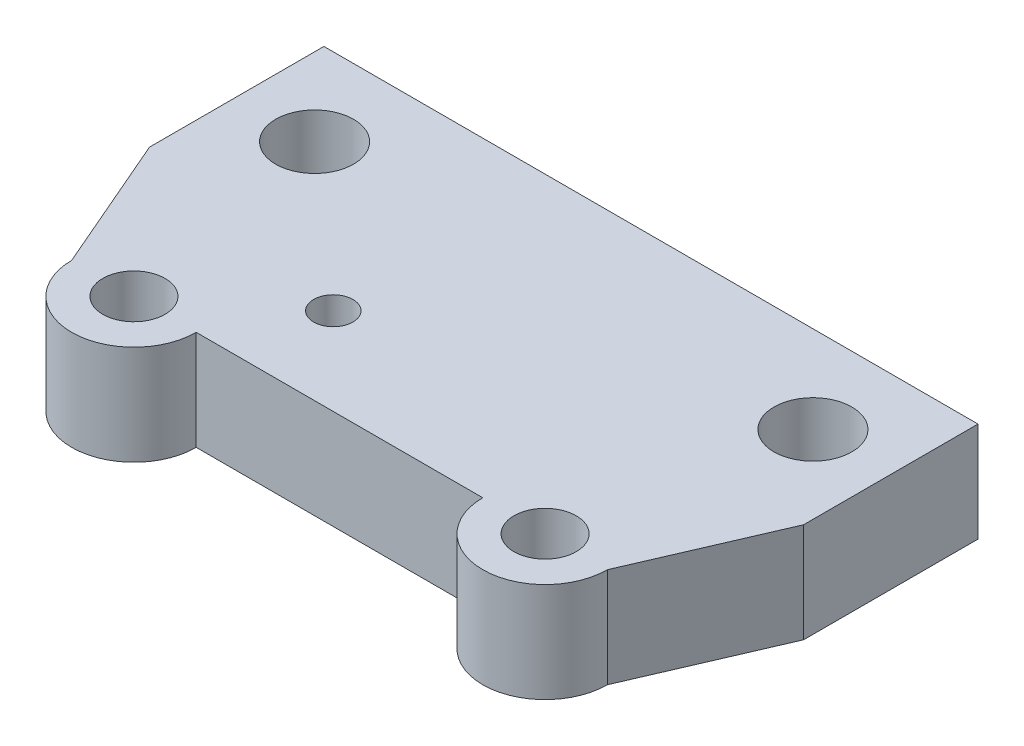
ISO-10303-21;
HEADER;
FILE_DESCRIPTION(('STEP AP214'),'2;1');
FILE_NAME('part.step','',(''),(''),'','','');
FILE_SCHEMA(('AUTOMOTIVE_DESIGN { 1 0 10303 214 1 1 1 1 }'));
ENDSEC;
DATA;
#1=APPLICATION_CONTEXT('core data for automotive mechanical design processes');
#2=APPLICATION_PROTOCOL_DEFINITION('international standard','automotive_design',2000,#1);
#3=PRODUCT_CONTEXT('',#1,'mechanical');
#4=PRODUCT('Part','Part','',(#3));
#5=PRODUCT_RELATED_PRODUCT_CATEGORY('part','',(#4));
#6=PRODUCT_DEFINITION_FORMATION('','',#4);
#7=PRODUCT_DEFINITION_CONTEXT('part definition',#1,'design');
#8=PRODUCT_DEFINITION('design','',#6,#7);
#9=PRODUCT_DEFINITION_SHAPE('','',#8);
#10=(LENGTH_UNIT() NAMED_UNIT(*) SI_UNIT(.MILLI.,.METRE.));
#11=(NAMED_UNIT(*) PLANE_ANGLE_UNIT() SI_UNIT($,.RADIAN.));
#12=(NAMED_UNIT(*) SI_UNIT($,.STERADIAN.) SOLID_ANGLE_UNIT());
#13=UNCERTAINTY_MEASURE_WITH_UNIT(LENGTH_MEASURE(1.E-05),#10,'distance_accuracy_value','');
#14=(GEOMETRIC_REPRESENTATION_CONTEXT(3) GLOBAL_UNCERTAINTY_ASSIGNED_CONTEXT((#13)) GLOBAL_UNIT_ASSIGNED_CONTEXT((#10,
#11,#12)) REPRESENTATION_CONTEXT('',''));
#15=CARTESIAN_POINT('',(0.,0.,0.));
#16=DIRECTION('',(0.,0.,1.));
#17=DIRECTION('',(1.,0.,0.));
#18=AXIS2_PLACEMENT_3D('',#15,#16,#17);
#19=CARTESIAN_POINT('',(41.91,-10.16,0.));
#20=DIRECTION('',(0.,1.,0.));
#21=DIRECTION('',(0.,0.,1.));
#22=AXIS2_PLACEMENT_3D('',#19,#20,#21);
#23=CYLINDRICAL_SURFACE('',#22,6.35);
#24=CARTESIAN_POINT('',(41.91,0.,0.));
#25=DIRECTION('',(0.,1.,0.));
#26=DIRECTION('',(0.,0.,-1.));
#27=AXIS2_PLACEMENT_3D('',#24,#25,#26);
#28=CIRCLE('',#27,6.35);
#29=CARTESIAN_POINT('',(35.56,0.,0.));
#30=VERTEX_POINT('',#29);
#31=CARTESIAN_POINT('',(48.26,0.,0.));
#32=VERTEX_POINT('',#31);
#33=EDGE_CURVE('E143',#30,#32,#28,.T.);
#34=ORIENTED_EDGE('',*,*,#33,.F.);
#35=DIRECTION('',(0.,1.,0.));
#36=VECTOR('',#35,1.);
#37=CARTESIAN_POINT('',(35.56,-10.16,0.));
#38=LINE('',#37,#36);
#39=CARTESIAN_POINT('',(35.56,-10.16,0.));
#40=VERTEX_POINT('',#39);
#41=EDGE_CURVE('E11',#40,#30,#38,.T.);
#42=ORIENTED_EDGE('',*,*,#41,.F.);
#43=CARTESIAN_POINT('',(41.91,-10.16,0.));
#44=DIRECTION('',(0.,1.,0.));
#45=DIRECTION('',(0.,0.,-1.));
#46=AXIS2_PLACEMENT_3D('',#43,#44,#45);
#47=CIRCLE('',#46,6.35);
#48=CARTESIAN_POINT('',(48.26,-10.16,0.));
#49=VERTEX_POINT('',#48);
#50=EDGE_CURVE('E172',#40,#49,#47,.T.);
#51=ORIENTED_EDGE('',*,*,#50,.T.);
#52=DIRECTION('',(0.,1.,0.));
#53=VECTOR('',#52,1.);
#54=CARTESIAN_POINT('',(48.26,-10.16,0.));
#55=LINE('',#54,#53);
#56=EDGE_CURVE('E43',#49,#32,#55,.T.);
#57=ORIENTED_EDGE('',*,*,#56,.T.);
#58=EDGE_LOOP('',(#34,#42,#51,#57));
#59=FACE_BOUND('',#58,.T.);
#60=ADVANCED_FACE('F40',(#59),#23,.T.);
#61=CARTESIAN_POINT('',(35.56,-10.16,0.));
#62=DIRECTION('',(0.,0.,1.));
#63=DIRECTION('',(1.,0.,0.));
#64=AXIS2_PLACEMENT_3D('',#61,#62,#63);
#65=PLANE('',#64);
#66=DIRECTION('',(1.,0.,0.));
#67=VECTOR('',#66,1.);
#68=CARTESIAN_POINT('',(35.56,0.,0.));
#69=LINE('',#68,#67);
#70=CARTESIAN_POINT('',(6.35,0.,0.));
#71=VERTEX_POINT('',#70);
#72=EDGE_CURVE('E169',#71,#30,#69,.T.);
#73=ORIENTED_EDGE('',*,*,#72,.F.);
#74=DIRECTION('',(0.,1.,0.));
#75=VECTOR('',#74,1.);
#76=CARTESIAN_POINT('',(6.35,-10.16,0.));
#77=LINE('',#76,#75);
#78=CARTESIAN_POINT('',(6.35,-10.16,0.));
#79=VERTEX_POINT('',#78);
#80=EDGE_CURVE('E50',#79,#71,#77,.T.);
#81=ORIENTED_EDGE('',*,*,#80,.F.);
#82=DIRECTION('',(1.,0.,0.));
#83=VECTOR('',#82,1.);
#84=CARTESIAN_POINT('',(35.56,-10.16,0.));
#85=LINE('',#84,#83);
#86=EDGE_CURVE('E129',#79,#40,#85,.T.);
#87=ORIENTED_EDGE('',*,*,#86,.T.);
#88=ORIENTED_EDGE('',*,*,#41,.T.);
#89=EDGE_LOOP('',(#73,#81,#87,#88));
#90=FACE_BOUND('',#89,.T.);
#91=ADVANCED_FACE('F190',(#90),#65,.T.);
#92=CARTESIAN_POINT('',(0.,-10.16,0.));
#93=DIRECTION('',(0.,1.,0.));
#94=DIRECTION('',(0.,0.,1.));
#95=AXIS2_PLACEMENT_3D('',#92,#93,#94);
#96=CYLINDRICAL_SURFACE('',#95,6.35);
#97=CARTESIAN_POINT('',(0.,0.,0.));
#98=DIRECTION('',(0.,1.,0.));
#99=DIRECTION('',(0.,0.,-1.));
#100=AXIS2_PLACEMENT_3D('',#97,#98,#99);
#101=CIRCLE('',#100,6.35);
#102=CARTESIAN_POINT('',(-6.35,0.,0.));
#103=VERTEX_POINT('',#102);
#104=EDGE_CURVE('E115',#103,#71,#101,.T.);
#105=ORIENTED_EDGE('',*,*,#104,.F.);
#106=DIRECTION('',(0.,1.,0.));
#107=VECTOR('',#106,1.);
#108=CARTESIAN_POINT('',(-6.35,-10.16,0.));
#109=LINE('',#108,#107);
#110=CARTESIAN_POINT('',(-6.35,-10.16,0.));
#111=VERTEX_POINT('',#110);
#112=EDGE_CURVE('E110',#111,#103,#109,.T.);
#113=ORIENTED_EDGE('',*,*,#112,.F.);
#114=CARTESIAN_POINT('',(0.,-10.16,0.));
#115=DIRECTION('',(0.,1.,0.));
#116=DIRECTION('',(0.,0.,-1.));
#117=AXIS2_PLACEMENT_3D('',#114,#115,#116);
#118=CIRCLE('',#117,6.35);
#119=EDGE_CURVE('E113',#111,#79,#118,.T.);
#120=ORIENTED_EDGE('',*,*,#119,.T.);
#121=ORIENTED_EDGE('',*,*,#80,.T.);
#122=EDGE_LOOP('',(#105,#113,#120,#121));
#123=FACE_BOUND('',#122,.T.);
#124=ADVANCED_FACE('F112',(#123),#96,.T.);
#125=CARTESIAN_POINT('',(-6.35,-10.16,0.));
#126=DIRECTION('',(-0.91806235353619,0.,0.396436016299719));
#127=DIRECTION('',(0.396436016299719,0.,0.91806235353619));
#128=AXIS2_PLACEMENT_3D('',#125,#126,#127);
#129=PLANE('',#128);
#130=DIRECTION('',(0.396436016299719,0.,0.91806235353619));
#131=VECTOR('',#130,1.);
#132=CARTESIAN_POINT('',(-6.35,0.,0.));
#133=LINE('',#132,#131);
#134=CARTESIAN_POINT('',(-12.3825,0.,-13.97));
#135=VERTEX_POINT('',#134);
#136=EDGE_CURVE('E164',#135,#103,#133,.T.);
#137=ORIENTED_EDGE('',*,*,#136,.F.);
#138=DIRECTION('',(0.,1.,0.));
#139=VECTOR('',#138,1.);
#140=CARTESIAN_POINT('',(-12.3825,-10.16,-13.97));
#141=LINE('',#140,#139);
#142=CARTESIAN_POINT('',(-12.3825,-10.16,-13.97));
#143=VERTEX_POINT('',#142);
#144=EDGE_CURVE('E121',#143,#135,#141,.T.);
#145=ORIENTED_EDGE('',*,*,#144,.F.);
#146=DIRECTION('',(0.396436016299719,0.,0.91806235353619));
#147=VECTOR('',#146,1.);
#148=CARTESIAN_POINT('',(-6.35,-10.16,0.));
#149=LINE('',#148,#147);
#150=EDGE_CURVE('E127',#143,#111,#149,.T.);
#151=ORIENTED_EDGE('',*,*,#150,.T.);
#152=ORIENTED_EDGE('',*,*,#112,.T.);
#153=EDGE_LOOP('',(#137,#145,#151,#152));
#154=FACE_BOUND('',#153,.T.);
#155=ADVANCED_FACE('F132',(#154),#129,.T.);
#156=CARTESIAN_POINT('',(-12.3825,-10.16,-31.75));
#157=DIRECTION('',(-1.,0.,0.));
#158=DIRECTION('',(0.,0.,1.));
#159=AXIS2_PLACEMENT_3D('',#156,#157,#158);
#160=PLANE('',#159);
#161=DIRECTION('',(0.,0.,1.));
#162=VECTOR('',#161,1.);
#163=CARTESIAN_POINT('',(-12.3825,0.,-31.75));
#164=LINE('',#163,#162);
#165=CARTESIAN_POINT('',(-12.3825,0.,-31.75));
#166=VERTEX_POINT('',#165);
#167=EDGE_CURVE('E160',#166,#135,#164,.T.);
#168=ORIENTED_EDGE('',*,*,#167,.F.);
#169=DIRECTION('',(0.,1.,0.));
#170=VECTOR('',#169,1.);
#171=CARTESIAN_POINT('',(-12.3825,-10.16,-31.75));
#172=LINE('',#171,#170);
#173=CARTESIAN_POINT('',(-12.3825,-10.16,-31.75));
#174=VERTEX_POINT('',#173);
#175=EDGE_CURVE('E178',#174,#166,#172,.T.);
#176=ORIENTED_EDGE('',*,*,#175,.F.);
#177=DIRECTION('',(0.,0.,1.));
#178=VECTOR('',#177,1.);
#179=CARTESIAN_POINT('',(-12.3825,-10.16,-31.75));
#180=LINE('',#179,#178);
#181=EDGE_CURVE('E134',#174,#143,#180,.T.);
#182=ORIENTED_EDGE('',*,*,#181,.T.);
#183=ORIENTED_EDGE('',*,*,#144,.T.);
#184=EDGE_LOOP('',(#168,#176,#182,#183));
#185=FACE_BOUND('',#184,.T.);
#186=ADVANCED_FACE('F203',(#185),#160,.T.);
#187=CARTESIAN_POINT('',(54.2925,-10.16,-31.75));
#188=DIRECTION('',(0.,0.,-1.));
#189=DIRECTION('',(-1.,0.,0.));
#190=AXIS2_PLACEMENT_3D('',#187,#188,#189);
#191=PLANE('',#190);
#192=DIRECTION('',(-1.,0.,0.));
#193=VECTOR('',#192,1.);
#194=CARTESIAN_POINT('',(54.2925,0.,-31.75));
#195=LINE('',#194,#193);
#196=CARTESIAN_POINT('',(54.2925,0.,-31.75));
#197=VERTEX_POINT('',#196);
#198=EDGE_CURVE('E156',#197,#166,#195,.T.);
#199=ORIENTED_EDGE('',*,*,#198,.F.);
#200=DIRECTION('',(0.,1.,0.));
#201=VECTOR('',#200,1.);
#202=CARTESIAN_POINT('',(54.2925,-10.16,-31.75));
#203=LINE('',#202,#201);
#204=CARTESIAN_POINT('',(54.2925,-10.16,-31.75));
#205=VERTEX_POINT('',#204);
#206=EDGE_CURVE('E181',#205,#197,#203,.T.);
#207=ORIENTED_EDGE('',*,*,#206,.F.);
#208=DIRECTION('',(-1.,0.,0.));
#209=VECTOR('',#208,1.);
#210=CARTESIAN_POINT('',(54.2925,-10.16,-31.75));
#211=LINE('',#210,#209);
#212=EDGE_CURVE('E137',#205,#174,#211,.T.);
#213=ORIENTED_EDGE('',*,*,#212,.T.);
#214=ORIENTED_EDGE('',*,*,#175,.T.);
#215=EDGE_LOOP('',(#199,#207,#213,#214));
#216=FACE_BOUND('',#215,.T.);
#217=ADVANCED_FACE('F206',(#216),#191,.T.);
#218=CARTESIAN_POINT('',(54.2925,-10.16,-31.75));
#219=DIRECTION('',(1.,0.,0.));
#220=DIRECTION('',(0.,0.,-1.));
#221=AXIS2_PLACEMENT_3D('',#218,#219,#220);
#222=PLANE('',#221);
#223=DIRECTION('',(0.,0.,-1.));
#224=VECTOR('',#223,1.);
#225=CARTESIAN_POINT('',(54.2925,0.,-31.75));
#226=LINE('',#225,#224);
#227=CARTESIAN_POINT('',(54.2925,0.,-13.97));
#228=VERTEX_POINT('',#227);
#229=EDGE_CURVE('E152',#228,#197,#226,.T.);
#230=ORIENTED_EDGE('',*,*,#229,.F.);
#231=DIRECTION('',(0.,1.,0.));
#232=VECTOR('',#231,1.);
#233=CARTESIAN_POINT('',(54.2925,-10.16,-13.97));
#234=LINE('',#233,#232);
#235=CARTESIAN_POINT('',(54.2925,-10.16,-13.97));
#236=VERTEX_POINT('',#235);
#237=EDGE_CURVE('E183',#236,#228,#234,.T.);
#238=ORIENTED_EDGE('',*,*,#237,.F.);
#239=DIRECTION('',(0.,0.,-1.));
#240=VECTOR('',#239,1.);
#241=CARTESIAN_POINT('',(54.2925,-10.16,-31.75));
#242=LINE('',#241,#240);
#243=EDGE_CURVE('E294',#236,#205,#242,.T.);
#244=ORIENTED_EDGE('',*,*,#243,.T.);
#245=ORIENTED_EDGE('',*,*,#206,.T.);
#246=EDGE_LOOP('',(#230,#238,#244,#245));
#247=FACE_BOUND('',#246,.T.);
#248=ADVANCED_FACE('F210',(#247),#222,.T.);
#249=CARTESIAN_POINT('',(48.26,-10.16,0.));
#250=DIRECTION('',(0.91806235353619,0.,0.396436016299719));
#251=DIRECTION('',(0.396436016299719,0.,-0.91806235353619));
#252=AXIS2_PLACEMENT_3D('',#249,#250,#251);
#253=PLANE('',#252);
#254=DIRECTION('',(0.396436016299719,0.,-0.91806235353619));
#255=VECTOR('',#254,1.);
#256=CARTESIAN_POINT('',(48.26,0.,0.));
#257=LINE('',#256,#255);
#258=EDGE_CURVE('E147',#32,#228,#257,.T.);
#259=ORIENTED_EDGE('',*,*,#258,.F.);
#260=ORIENTED_EDGE('',*,*,#56,.F.);
#261=DIRECTION('',(0.396436016299719,0.,-0.91806235353619));
#262=VECTOR('',#261,1.);
#263=CARTESIAN_POINT('',(48.26,-10.16,0.));
#264=LINE('',#263,#262);
#265=EDGE_CURVE('E291',#49,#236,#264,.T.);
#266=ORIENTED_EDGE('',*,*,#265,.T.);
#267=ORIENTED_EDGE('',*,*,#237,.T.);
#268=EDGE_LOOP('',(#259,#260,#266,#267));
#269=FACE_BOUND('',#268,.T.);
#270=ADVANCED_FACE('F187',(#269),#253,.T.);
#271=CARTESIAN_POINT('',(41.91,-10.16,0.));
#272=DIRECTION('',(0.,-1.,0.));
#273=DIRECTION('',(0.,0.,-1.));
#274=AXIS2_PLACEMENT_3D('',#271,#272,#273);
#275=PLANE('',#274);
#276=CARTESIAN_POINT('',(11.43,-10.16,-8.89));
#277=DIRECTION('',(0.,1.,0.));
#278=DIRECTION('',(0.,0.,1.));
#279=AXIS2_PLACEMENT_3D('',#276,#277,#278);
#280=CIRCLE('',#279,2.);
#281=CARTESIAN_POINT('',(11.43,-10.16,-6.89));
#282=VERTEX_POINT('',#281);
#283=EDGE_CURVE('E249',#282,#282,#280,.T.);
#284=ORIENTED_EDGE('',*,*,#283,.T.);
#285=EDGE_LOOP('',(#284));
#286=FACE_BOUND('',#285,.T.);
#287=CARTESIAN_POINT('',(-4.445,-10.16,-22.86));
#288=DIRECTION('',(0.,1.,0.));
#289=DIRECTION('',(0.,0.,1.));
#290=AXIS2_PLACEMENT_3D('',#287,#288,#289);
#291=CIRCLE('',#290,3.96875);
#292=CARTESIAN_POINT('',(-4.445,-10.16,-18.89125));
#293=VERTEX_POINT('',#292);
#294=EDGE_CURVE('E259',#293,#293,#291,.T.);
#295=ORIENTED_EDGE('',*,*,#294,.T.);
#296=EDGE_LOOP('',(#295));
#297=FACE_BOUND('',#296,.T.);
#298=CARTESIAN_POINT('',(46.355,-10.16,-22.86));
#299=DIRECTION('',(0.,1.,0.));
#300=DIRECTION('',(0.,0.,1.));
#301=AXIS2_PLACEMENT_3D('',#298,#299,#300);
#302=CIRCLE('',#301,3.96875000000001);
#303=CARTESIAN_POINT('',(46.355,-10.16,-18.89125));
#304=VERTEX_POINT('',#303);
#305=EDGE_CURVE('E267',#304,#304,#302,.T.);
#306=ORIENTED_EDGE('',*,*,#305,.T.);
#307=EDGE_LOOP('',(#306));
#308=FACE_BOUND('',#307,.T.);
#309=CARTESIAN_POINT('',(41.91,-10.16,0.));
#310=DIRECTION('',(0.,1.,0.));
#311=DIRECTION('',(0.,0.,1.));
#312=AXIS2_PLACEMENT_3D('',#309,#310,#311);
#313=CIRCLE('',#312,3.175);
#314=CARTESIAN_POINT('',(41.91,-10.16,3.175));
#315=VERTEX_POINT('',#314);
#316=EDGE_CURVE('E275',#315,#315,#313,.T.);
#317=ORIENTED_EDGE('',*,*,#316,.T.);
#318=EDGE_LOOP('',(#317));
#319=FACE_BOUND('',#318,.T.);
#320=CARTESIAN_POINT('',(0.,-10.16,0.));
#321=DIRECTION('',(0.,1.,0.));
#322=DIRECTION('',(0.,0.,1.));
#323=AXIS2_PLACEMENT_3D('',#320,#321,#322);
#324=CIRCLE('',#323,3.175);
#325=CARTESIAN_POINT('',(0.,-10.16,3.175));
#326=VERTEX_POINT('',#325);
#327=EDGE_CURVE('E148',#326,#326,#324,.T.);
#328=ORIENTED_EDGE('',*,*,#327,.T.);
#329=EDGE_LOOP('',(#328));
#330=FACE_BOUND('',#329,.T.);
#331=ORIENTED_EDGE('',*,*,#50,.F.);
#332=ORIENTED_EDGE('',*,*,#86,.F.);
#333=ORIENTED_EDGE('',*,*,#119,.F.);
#334=ORIENTED_EDGE('',*,*,#150,.F.);
#335=ORIENTED_EDGE('',*,*,#181,.F.);
#336=ORIENTED_EDGE('',*,*,#212,.F.);
#337=ORIENTED_EDGE('',*,*,#243,.F.);
#338=ORIENTED_EDGE('',*,*,#265,.F.);
#339=EDGE_LOOP('',(#331,#332,#333,#334,#335,#336,#337,#338));
#340=FACE_BOUND('',#339,.T.);
#341=ADVANCED_FACE('F125',(#286,#297,#308,#319,#330,#340),#275,.T.);
#342=CARTESIAN_POINT('',(41.91,0.,0.));
#343=DIRECTION('',(0.,-1.,0.));
#344=DIRECTION('',(0.,0.,-1.));
#345=AXIS2_PLACEMENT_3D('',#342,#343,#344);
#346=PLANE('',#345);
#347=CARTESIAN_POINT('',(11.43,0.,-8.89));
#348=DIRECTION('',(0.,1.,0.));
#349=DIRECTION('',(0.,0.,1.));
#350=AXIS2_PLACEMENT_3D('',#347,#348,#349);
#351=CIRCLE('',#350,2.);
#352=CARTESIAN_POINT('',(11.43,0.,-6.89));
#353=VERTEX_POINT('',#352);
#354=EDGE_CURVE('E252',#353,#353,#351,.T.);
#355=ORIENTED_EDGE('',*,*,#354,.F.);
#356=EDGE_LOOP('',(#355));
#357=FACE_BOUND('',#356,.T.);
#358=CARTESIAN_POINT('',(-4.445,0.,-22.86));
#359=DIRECTION('',(0.,1.,0.));
#360=DIRECTION('',(0.,0.,1.));
#361=AXIS2_PLACEMENT_3D('',#358,#359,#360);
#362=CIRCLE('',#361,3.96875);
#363=CARTESIAN_POINT('',(-4.445,0.,-18.89125));
#364=VERTEX_POINT('',#363);
#365=EDGE_CURVE('E256',#364,#364,#362,.T.);
#366=ORIENTED_EDGE('',*,*,#365,.F.);
#367=EDGE_LOOP('',(#366));
#368=FACE_BOUND('',#367,.T.);
#369=CARTESIAN_POINT('',(46.355,0.,-22.86));
#370=DIRECTION('',(0.,1.,0.));
#371=DIRECTION('',(0.,0.,1.));
#372=AXIS2_PLACEMENT_3D('',#369,#370,#371);
#373=CIRCLE('',#372,3.96875000000001);
#374=CARTESIAN_POINT('',(46.355,0.,-18.89125));
#375=VERTEX_POINT('',#374);
#376=EDGE_CURVE('E263',#375,#375,#373,.T.);
#377=ORIENTED_EDGE('',*,*,#376,.F.);
#378=EDGE_LOOP('',(#377));
#379=FACE_BOUND('',#378,.T.);
#380=CARTESIAN_POINT('',(41.91,0.,0.));
#381=DIRECTION('',(0.,1.,0.));
#382=DIRECTION('',(0.,0.,1.));
#383=AXIS2_PLACEMENT_3D('',#380,#381,#382);
#384=CIRCLE('',#383,3.175);
#385=CARTESIAN_POINT('',(41.91,0.,3.175));
#386=VERTEX_POINT('',#385);
#387=EDGE_CURVE('E271',#386,#386,#384,.T.);
#388=ORIENTED_EDGE('',*,*,#387,.F.);
#389=EDGE_LOOP('',(#388));
#390=FACE_BOUND('',#389,.T.);
#391=CARTESIAN_POINT('',(0.,0.,0.));
#392=DIRECTION('',(0.,1.,0.));
#393=DIRECTION('',(0.,0.,1.));
#394=AXIS2_PLACEMENT_3D('',#391,#392,#393);
#395=CIRCLE('',#394,3.175);
#396=CARTESIAN_POINT('',(0.,0.,3.175));
#397=VERTEX_POINT('',#396);
#398=EDGE_CURVE('E279',#397,#397,#395,.T.);
#399=ORIENTED_EDGE('',*,*,#398,.F.);
#400=EDGE_LOOP('',(#399));
#401=FACE_BOUND('',#400,.T.);
#402=ORIENTED_EDGE('',*,*,#33,.T.);
#403=ORIENTED_EDGE('',*,*,#258,.T.);
#404=ORIENTED_EDGE('',*,*,#229,.T.);
#405=ORIENTED_EDGE('',*,*,#198,.T.);
#406=ORIENTED_EDGE('',*,*,#167,.T.);
#407=ORIENTED_EDGE('',*,*,#136,.T.);
#408=ORIENTED_EDGE('',*,*,#104,.T.);
#409=ORIENTED_EDGE('',*,*,#72,.T.);
#410=EDGE_LOOP('',(#402,#403,#404,#405,#406,#407,#408,#409));
#411=FACE_BOUND('',#410,.T.);
#412=ADVANCED_FACE('F189',(#357,#368,#379,#390,#401,#411),#346,.F.);
#413=CARTESIAN_POINT('',(0.,-10.16,0.));
#414=DIRECTION('',(0.,1.,0.));
#415=DIRECTION('',(0.,0.,1.));
#416=AXIS2_PLACEMENT_3D('',#413,#414,#415);
#417=CYLINDRICAL_SURFACE('',#416,3.175);
#418=ORIENTED_EDGE('',*,*,#327,.F.);
#419=EDGE_LOOP('',(#418));
#420=FACE_BOUND('',#419,.T.);
#421=ORIENTED_EDGE('',*,*,#398,.T.);
#422=EDGE_LOOP('',(#421));
#423=FACE_BOUND('',#422,.T.);
#424=ADVANCED_FACE('F222',(#420,#423),#417,.F.);
#425=CARTESIAN_POINT('',(41.91,-10.16,0.));
#426=DIRECTION('',(0.,1.,0.));
#427=DIRECTION('',(0.,0.,1.));
#428=AXIS2_PLACEMENT_3D('',#425,#426,#427);
#429=CYLINDRICAL_SURFACE('',#428,3.175);
#430=ORIENTED_EDGE('',*,*,#316,.F.);
#431=EDGE_LOOP('',(#430));
#432=FACE_BOUND('',#431,.T.);
#433=ORIENTED_EDGE('',*,*,#387,.T.);
#434=EDGE_LOOP('',(#433));
#435=FACE_BOUND('',#434,.T.);
#436=ADVANCED_FACE('F229',(#432,#435),#429,.F.);
#437=CARTESIAN_POINT('',(46.355,-10.16,-22.86));
#438=DIRECTION('',(0.,1.,0.));
#439=DIRECTION('',(0.,0.,1.));
#440=AXIS2_PLACEMENT_3D('',#437,#438,#439);
#441=CYLINDRICAL_SURFACE('',#440,3.96875000000001);
#442=ORIENTED_EDGE('',*,*,#305,.F.);
#443=EDGE_LOOP('',(#442));
#444=FACE_BOUND('',#443,.T.);
#445=ORIENTED_EDGE('',*,*,#376,.T.);
#446=EDGE_LOOP('',(#445));
#447=FACE_BOUND('',#446,.T.);
#448=ADVANCED_FACE('F233',(#444,#447),#441,.F.);
#449=CARTESIAN_POINT('',(-4.445,-10.16,-22.86));
#450=DIRECTION('',(0.,1.,0.));
#451=DIRECTION('',(0.,0.,1.));
#452=AXIS2_PLACEMENT_3D('',#449,#450,#451);
#453=CYLINDRICAL_SURFACE('',#452,3.96875);
#454=ORIENTED_EDGE('',*,*,#294,.F.);
#455=EDGE_LOOP('',(#454));
#456=FACE_BOUND('',#455,.T.);
#457=ORIENTED_EDGE('',*,*,#365,.T.);
#458=EDGE_LOOP('',(#457));
#459=FACE_BOUND('',#458,.T.);
#460=ADVANCED_FACE('F237',(#456,#459),#453,.F.);
#461=CARTESIAN_POINT('',(11.43,-10.16,-8.89));
#462=DIRECTION('',(0.,1.,0.));
#463=DIRECTION('',(0.,0.,1.));
#464=AXIS2_PLACEMENT_3D('',#461,#462,#463);
#465=CYLINDRICAL_SURFACE('',#464,2.);
#466=ORIENTED_EDGE('',*,*,#283,.F.);
#467=EDGE_LOOP('',(#466));
#468=FACE_BOUND('',#467,.T.);
#469=ORIENTED_EDGE('',*,*,#354,.T.);
#470=EDGE_LOOP('',(#469));
#471=FACE_BOUND('',#470,.T.);
#472=ADVANCED_FACE('F241',(#468,#471),#465,.F.);
#473=CLOSED_SHELL('',(#60,#91,#124,#155,#186,#217,#248,#270,#341,#412,#424,#436,#448,#460,#472));
#474=MANIFOLD_SOLID_BREP('B2',#473);
#475=ADVANCED_BREP_SHAPE_REPRESENTATION('',(#18,#474),#14);
#476=SHAPE_DEFINITION_REPRESENTATION(#9,#475);
ENDSEC;
END-ISO-10303-21;
